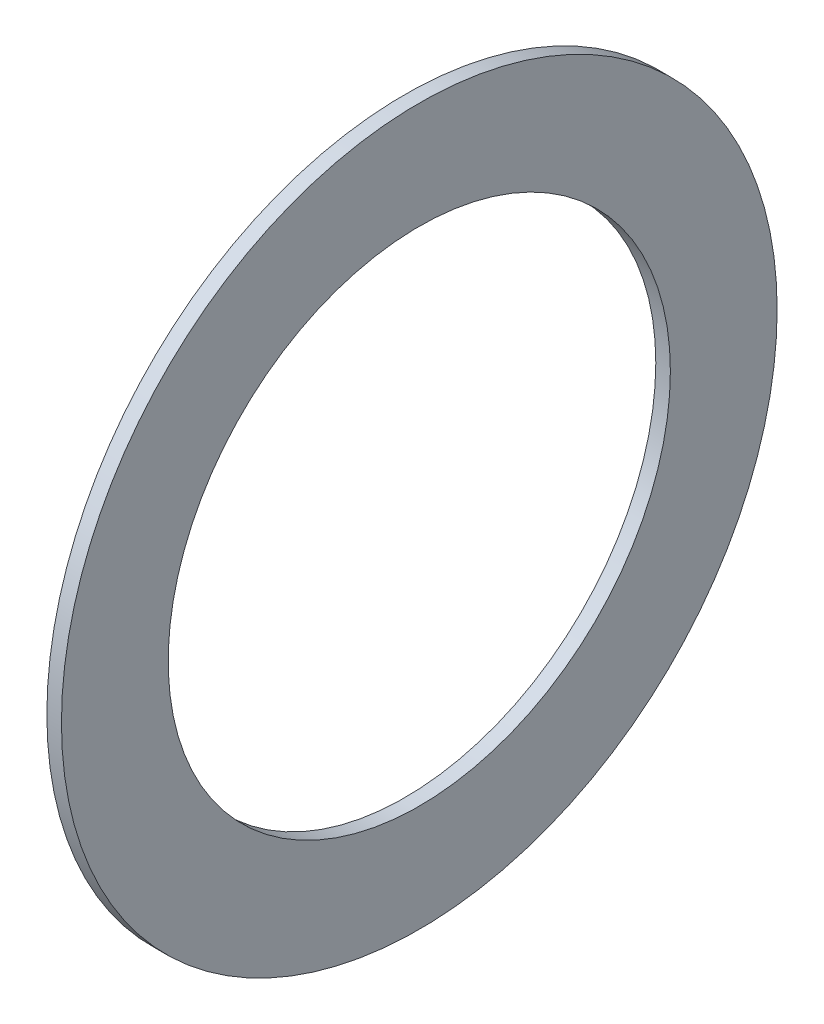
ISO-10303-21;
HEADER;
FILE_DESCRIPTION(('STEP AP214'),'2;1');
FILE_NAME('part.step','',(''),(''),'','','');
FILE_SCHEMA(('AUTOMOTIVE_DESIGN { 1 0 10303 214 1 1 1 1 }'));
ENDSEC;
DATA;
#1=APPLICATION_CONTEXT('core data for automotive mechanical design processes');
#2=APPLICATION_PROTOCOL_DEFINITION('international standard','automotive_design',2000,#1);
#3=PRODUCT_CONTEXT('',#1,'mechanical');
#4=PRODUCT('Part','Part','',(#3));
#5=PRODUCT_RELATED_PRODUCT_CATEGORY('part','',(#4));
#6=PRODUCT_DEFINITION_FORMATION('','',#4);
#7=PRODUCT_DEFINITION_CONTEXT('part definition',#1,'design');
#8=PRODUCT_DEFINITION('design','',#6,#7);
#9=PRODUCT_DEFINITION_SHAPE('','',#8);
#10=(LENGTH_UNIT() NAMED_UNIT(*) SI_UNIT(.MILLI.,.METRE.));
#11=(NAMED_UNIT(*) PLANE_ANGLE_UNIT() SI_UNIT($,.RADIAN.));
#12=(NAMED_UNIT(*) SI_UNIT($,.STERADIAN.) SOLID_ANGLE_UNIT());
#13=UNCERTAINTY_MEASURE_WITH_UNIT(LENGTH_MEASURE(1.E-05),#10,'distance_accuracy_value','');
#14=(GEOMETRIC_REPRESENTATION_CONTEXT(3) GLOBAL_UNCERTAINTY_ASSIGNED_CONTEXT((#13)) GLOBAL_UNIT_ASSIGNED_CONTEXT((#10,
#11,#12)) REPRESENTATION_CONTEXT('',''));
#15=CARTESIAN_POINT('',(0.,0.,0.));
#16=DIRECTION('',(0.,0.,1.));
#17=DIRECTION('',(1.,0.,0.));
#18=AXIS2_PLACEMENT_3D('',#15,#16,#17);
#19=CARTESIAN_POINT('',(3.,0.,0.));
#20=DIRECTION('',(1.,0.,0.));
#21=DIRECTION('',(0.,0.,-1.));
#22=AXIS2_PLACEMENT_3D('',#19,#20,#21);
#23=PLANE('',#22);
#24=CARTESIAN_POINT('',(3.,0.,0.));
#25=DIRECTION('',(1.,0.,0.));
#26=DIRECTION('',(0.,0.,-1.));
#27=AXIS2_PLACEMENT_3D('',#24,#25,#26);
#28=CIRCLE('',#27,73.6092);
#29=CARTESIAN_POINT('',(3.,0.,-73.6092));
#30=VERTEX_POINT('',#29);
#31=EDGE_CURVE('E10',#30,#30,#28,.T.);
#32=ORIENTED_EDGE('',*,*,#31,.T.);
#33=EDGE_LOOP('',(#32));
#34=FACE_BOUND('',#33,.T.);
#35=CARTESIAN_POINT('',(3.,0.,0.));
#36=DIRECTION('',(1.,0.,0.));
#37=DIRECTION('',(0.,0.,-1.));
#38=AXIS2_PLACEMENT_3D('',#35,#36,#37);
#39=CIRCLE('',#38,51.6489999999999);
#40=CARTESIAN_POINT('',(3.,0.,-51.6489999999999));
#41=VERTEX_POINT('',#40);
#42=EDGE_CURVE('E43',#41,#41,#39,.T.);
#43=ORIENTED_EDGE('',*,*,#42,.F.);
#44=EDGE_LOOP('',(#43));
#45=FACE_BOUND('',#44,.T.);
#46=ADVANCED_FACE('F32',(#34,#45),#23,.T.);
#47=CARTESIAN_POINT('',(0.,0.,0.));
#48=DIRECTION('',(1.,0.,0.));
#49=DIRECTION('',(0.,0.,-1.));
#50=AXIS2_PLACEMENT_3D('',#47,#48,#49);
#51=PLANE('',#50);
#52=CARTESIAN_POINT('',(0.,0.,0.));
#53=DIRECTION('',(1.,0.,0.));
#54=DIRECTION('',(0.,0.,-1.));
#55=AXIS2_PLACEMENT_3D('',#52,#53,#54);
#56=CIRCLE('',#55,73.6092);
#57=CARTESIAN_POINT('',(0.,0.,-73.6092));
#58=VERTEX_POINT('',#57);
#59=EDGE_CURVE('E36',#58,#58,#56,.T.);
#60=ORIENTED_EDGE('',*,*,#59,.F.);
#61=EDGE_LOOP('',(#60));
#62=FACE_BOUND('',#61,.T.);
#63=CARTESIAN_POINT('',(0.,0.,0.));
#64=DIRECTION('',(1.,0.,0.));
#65=DIRECTION('',(0.,0.,-1.));
#66=AXIS2_PLACEMENT_3D('',#63,#64,#65);
#67=CIRCLE('',#66,51.6489999999999);
#68=CARTESIAN_POINT('',(0.,0.,-51.6489999999999));
#69=VERTEX_POINT('',#68);
#70=EDGE_CURVE('E45',#69,#69,#67,.T.);
#71=ORIENTED_EDGE('',*,*,#70,.T.);
#72=EDGE_LOOP('',(#71));
#73=FACE_BOUND('',#72,.T.);
#74=ADVANCED_FACE('F55',(#62,#73),#51,.F.);
#75=CARTESIAN_POINT('',(3.,0.,0.));
#76=DIRECTION('',(-1.,0.,0.));
#77=DIRECTION('',(0.,0.,1.));
#78=AXIS2_PLACEMENT_3D('',#75,#76,#77);
#79=CYLINDRICAL_SURFACE('',#78,73.6092);
#80=ORIENTED_EDGE('',*,*,#31,.F.);
#81=EDGE_LOOP('',(#80));
#82=FACE_BOUND('',#81,.T.);
#83=ORIENTED_EDGE('',*,*,#59,.T.);
#84=EDGE_LOOP('',(#83));
#85=FACE_BOUND('',#84,.T.);
#86=ADVANCED_FACE('F34',(#82,#85),#79,.T.);
#87=CARTESIAN_POINT('',(3.,0.,0.));
#88=DIRECTION('',(-1.,0.,0.));
#89=DIRECTION('',(0.,0.,1.));
#90=AXIS2_PLACEMENT_3D('',#87,#88,#89);
#91=CYLINDRICAL_SURFACE('',#90,51.6489999999999);
#92=ORIENTED_EDGE('',*,*,#42,.T.);
#93=EDGE_LOOP('',(#92));
#94=FACE_BOUND('',#93,.T.);
#95=ORIENTED_EDGE('',*,*,#70,.F.);
#96=EDGE_LOOP('',(#95));
#97=FACE_BOUND('',#96,.T.);
#98=ADVANCED_FACE('F51',(#94,#97),#91,.F.);
#99=CLOSED_SHELL('',(#46,#74,#86,#98));
#100=MANIFOLD_SOLID_BREP('B2',#99);
#101=ADVANCED_BREP_SHAPE_REPRESENTATION('',(#18,#100),#14);
#102=SHAPE_DEFINITION_REPRESENTATION(#9,#101);
ENDSEC;
END-ISO-10303-21;
